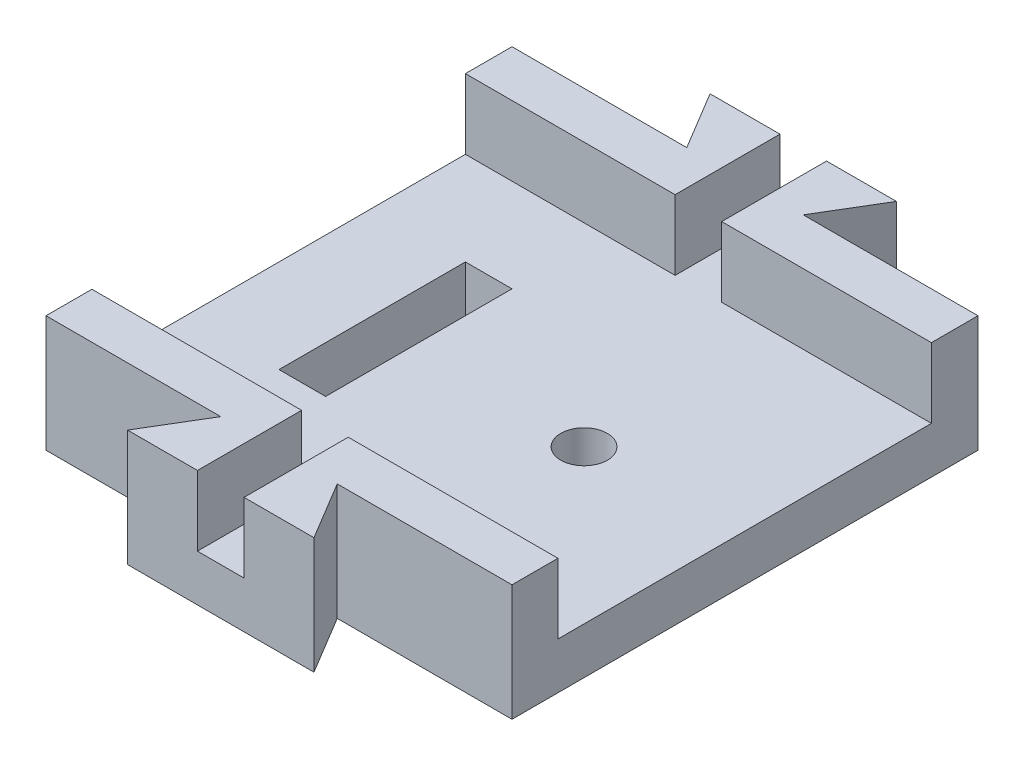
ISO-10303-21;
HEADER;
FILE_DESCRIPTION(('STEP AP214'),'2;1');
FILE_NAME('part.step','',(''),(''),'','','');
FILE_SCHEMA(('AUTOMOTIVE_DESIGN { 1 0 10303 214 1 1 1 1 }'));
ENDSEC;
DATA;
#1=APPLICATION_CONTEXT('core data for automotive mechanical design processes');
#2=APPLICATION_PROTOCOL_DEFINITION('international standard','automotive_design',2000,#1);
#3=PRODUCT_CONTEXT('',#1,'mechanical');
#4=PRODUCT('Part','Part','',(#3));
#5=PRODUCT_RELATED_PRODUCT_CATEGORY('part','',(#4));
#6=PRODUCT_DEFINITION_FORMATION('','',#4);
#7=PRODUCT_DEFINITION_CONTEXT('part definition',#1,'design');
#8=PRODUCT_DEFINITION('design','',#6,#7);
#9=PRODUCT_DEFINITION_SHAPE('','',#8);
#10=(LENGTH_UNIT() NAMED_UNIT(*) SI_UNIT(.MILLI.,.METRE.));
#11=(NAMED_UNIT(*) PLANE_ANGLE_UNIT() SI_UNIT($,.RADIAN.));
#12=(NAMED_UNIT(*) SI_UNIT($,.STERADIAN.) SOLID_ANGLE_UNIT());
#13=UNCERTAINTY_MEASURE_WITH_UNIT(LENGTH_MEASURE(1.E-05),#10,'distance_accuracy_value','');
#14=(GEOMETRIC_REPRESENTATION_CONTEXT(3) GLOBAL_UNCERTAINTY_ASSIGNED_CONTEXT((#13)) GLOBAL_UNIT_ASSIGNED_CONTEXT((#10,
#11,#12)) REPRESENTATION_CONTEXT('',''));
#15=CARTESIAN_POINT('',(0.,0.,0.));
#16=DIRECTION('',(0.,0.,1.));
#17=DIRECTION('',(1.,0.,0.));
#18=AXIS2_PLACEMENT_3D('',#15,#16,#17);
#19=CARTESIAN_POINT('',(0.,50.,0.));
#20=DIRECTION('',(0.,1.,0.));
#21=DIRECTION('',(0.,0.,1.));
#22=AXIS2_PLACEMENT_3D('',#19,#20,#21);
#23=PLANE('',#22);
#24=DIRECTION('',(-1.,0.,0.));
#25=VECTOR('',#24,1.);
#26=CARTESIAN_POINT('',(-59.3210532121283,50.,-154.932071061972));
#27=LINE('',#26,#25);
#28=CARTESIAN_POINT('',(140.678946787872,50.,-154.932071061972));
#29=VERTEX_POINT('',#28);
#30=CARTESIAN_POINT('',(50.6789467878717,50.,-154.932071061972));
#31=VERTEX_POINT('',#30);
#32=EDGE_CURVE('E402',#29,#31,#27,.T.);
#33=ORIENTED_EDGE('',*,*,#32,.F.);
#34=DIRECTION('',(0.,0.,-1.));
#35=VECTOR('',#34,1.);
#36=CARTESIAN_POINT('',(140.678946787872,50.,-174.932071061972));
#37=LINE('',#36,#35);
#38=CARTESIAN_POINT('',(140.678946787872,50.,-174.932071061972));
#39=VERTEX_POINT('',#38);
#40=EDGE_CURVE('E247',#29,#39,#37,.T.);
#41=ORIENTED_EDGE('',*,*,#40,.T.);
#42=DIRECTION('',(-1.,0.,0.));
#43=VECTOR('',#42,1.);
#44=CARTESIAN_POINT('',(-59.3210532121283,50.,-174.932071061972));
#45=LINE('',#44,#43);
#46=CARTESIAN_POINT('',(65.6789467878717,50.,-174.932071061972));
#47=VERTEX_POINT('',#46);
#48=EDGE_CURVE('E249',#39,#47,#45,.T.);
#49=ORIENTED_EDGE('',*,*,#48,.T.);
#50=DIRECTION('',(-0.514495755427526,0.,0.857492925712544));
#51=VECTOR('',#50,1.);
#52=CARTESIAN_POINT('',(80.6789467878717,50.,-199.932071061972));
#53=LINE('',#52,#51);
#54=CARTESIAN_POINT('',(80.6789467878717,50.,-199.932071061972));
#55=VERTEX_POINT('',#54);
#56=EDGE_CURVE('E322',#55,#47,#53,.T.);
#57=ORIENTED_EDGE('',*,*,#56,.F.);
#58=DIRECTION('',(1.,0.,0.));
#59=VECTOR('',#58,1.);
#60=CARTESIAN_POINT('',(0.678946787871695,50.,-199.932071061972));
#61=LINE('',#60,#59);
#62=CARTESIAN_POINT('',(50.6789467878717,50.,-199.932071061972));
#63=VERTEX_POINT('',#62);
#64=EDGE_CURVE('E325',#63,#55,#61,.T.);
#65=ORIENTED_EDGE('',*,*,#64,.F.);
#66=DIRECTION('',(0.,0.,1.));
#67=VECTOR('',#66,1.);
#68=CARTESIAN_POINT('',(50.6789467878717,50.,-154.932071061972));
#69=LINE('',#68,#67);
#70=EDGE_CURVE('E287',#63,#31,#69,.T.);
#71=ORIENTED_EDGE('',*,*,#70,.T.);
#72=EDGE_LOOP('',(#33,#41,#49,#57,#65,#71));
#73=FACE_BOUND('',#72,.T.);
#74=ADVANCED_FACE('F39',(#73),#23,.T.);
#75=DIRECTION('',(0.,0.,1.));
#76=VECTOR('',#75,1.);
#77=CARTESIAN_POINT('',(-59.3210532121283,50.,-174.932071061972));
#78=LINE('',#77,#76);
#79=CARTESIAN_POINT('',(-59.3210532121283,50.,-174.932071061972));
#80=VERTEX_POINT('',#79);
#81=CARTESIAN_POINT('',(-59.3210532121283,50.,-154.932071061972));
#82=VERTEX_POINT('',#81);
#83=EDGE_CURVE('E423',#80,#82,#78,.T.);
#84=ORIENTED_EDGE('',*,*,#83,.T.);
#85=CARTESIAN_POINT('',(30.6789467878717,50.,-154.932071061972));
#86=VERTEX_POINT('',#85);
#87=EDGE_CURVE('E401',#86,#82,#27,.T.);
#88=ORIENTED_EDGE('',*,*,#87,.F.);
#89=DIRECTION('',(0.,0.,-1.));
#90=VECTOR('',#89,1.);
#91=CARTESIAN_POINT('',(30.6789467878717,50.,-199.932071061972));
#92=LINE('',#91,#90);
#93=CARTESIAN_POINT('',(30.6789467878717,50.,-199.932071061972));
#94=VERTEX_POINT('',#93);
#95=EDGE_CURVE('E282',#86,#94,#92,.T.);
#96=ORIENTED_EDGE('',*,*,#95,.T.);
#97=CARTESIAN_POINT('',(0.678946787871695,50.,-199.932071061972));
#98=VERTEX_POINT('',#97);
#99=EDGE_CURVE('E326',#98,#94,#61,.T.);
#100=ORIENTED_EDGE('',*,*,#99,.F.);
#101=DIRECTION('',(-0.514495755427526,0.,-0.857492925712544));
#102=VECTOR('',#101,1.);
#103=CARTESIAN_POINT('',(15.6789467878717,50.,-174.932071061972));
#104=LINE('',#103,#102);
#105=CARTESIAN_POINT('',(15.6789467878717,50.,-174.932071061972));
#106=VERTEX_POINT('',#105);
#107=EDGE_CURVE('E319',#106,#98,#104,.T.);
#108=ORIENTED_EDGE('',*,*,#107,.F.);
#109=EDGE_CURVE('E246',#106,#80,#45,.T.);
#110=ORIENTED_EDGE('',*,*,#109,.T.);
#111=EDGE_LOOP('',(#84,#88,#96,#100,#108,#110));
#112=FACE_BOUND('',#111,.T.);
#113=ADVANCED_FACE('F499',(#112),#23,.T.);
#114=DIRECTION('',(1.,0.,0.));
#115=VECTOR('',#114,1.);
#116=CARTESIAN_POINT('',(-72.3210532121284,50.,5.36086052880691));
#117=LINE('',#116,#115);
#118=CARTESIAN_POINT('',(50.6789467878717,50.,5.36086052880691));
#119=VERTEX_POINT('',#118);
#120=CARTESIAN_POINT('',(140.678946787872,50.,5.36086052880691));
#121=VERTEX_POINT('',#120);
#122=EDGE_CURVE('E221',#119,#121,#117,.T.);
#123=ORIENTED_EDGE('',*,*,#122,.F.);
#124=DIRECTION('',(0.,0.,-1.));
#125=VECTOR('',#124,1.);
#126=CARTESIAN_POINT('',(50.6789467878717,50.,5.06792893802841));
#127=LINE('',#126,#125);
#128=CARTESIAN_POINT('',(50.6789467878717,50.,50.0679289380284));
#129=VERTEX_POINT('',#128);
#130=EDGE_CURVE('E345',#129,#119,#127,.T.);
#131=ORIENTED_EDGE('',*,*,#130,.F.);
#132=DIRECTION('',(1.,0.,0.));
#133=VECTOR('',#132,1.);
#134=CARTESIAN_POINT('',(0.678946787871695,50.,50.0679289380284));
#135=LINE('',#134,#133);
#136=CARTESIAN_POINT('',(80.6789467878717,50.,50.0679289380284));
#137=VERTEX_POINT('',#136);
#138=EDGE_CURVE('E366',#129,#137,#135,.T.);
#139=ORIENTED_EDGE('',*,*,#138,.T.);
#140=DIRECTION('',(-0.514495755427526,0.,-0.857492925712544));
#141=VECTOR('',#140,1.);
#142=CARTESIAN_POINT('',(80.6789467878717,50.,50.0679289380284));
#143=LINE('',#142,#141);
#144=CARTESIAN_POINT('',(65.6789467878717,50.,25.0679289380284));
#145=VERTEX_POINT('',#144);
#146=EDGE_CURVE('E371',#137,#145,#143,.T.);
#147=ORIENTED_EDGE('',*,*,#146,.T.);
#148=DIRECTION('',(1.,0.,0.));
#149=VECTOR('',#148,1.);
#150=CARTESIAN_POINT('',(-59.3210532121283,50.,25.0679289380284));
#151=LINE('',#150,#149);
#152=CARTESIAN_POINT('',(140.678946787872,50.,25.0679289380284));
#153=VERTEX_POINT('',#152);
#154=EDGE_CURVE('E244',#145,#153,#151,.T.);
#155=ORIENTED_EDGE('',*,*,#154,.T.);
#156=EDGE_CURVE('E237',#153,#121,#37,.T.);
#157=ORIENTED_EDGE('',*,*,#156,.T.);
#158=EDGE_LOOP('',(#123,#131,#139,#147,#155,#157));
#159=FACE_BOUND('',#158,.T.);
#160=ADVANCED_FACE('F242',(#159),#23,.T.);
#161=CARTESIAN_POINT('',(-59.3210532121283,50.,5.36086052880691));
#162=VERTEX_POINT('',#161);
#163=CARTESIAN_POINT('',(30.6789467878717,50.,5.36086052880692));
#164=VERTEX_POINT('',#163);
#165=EDGE_CURVE('E54',#162,#164,#117,.T.);
#166=ORIENTED_EDGE('',*,*,#165,.F.);
#167=CARTESIAN_POINT('',(-59.3210532121283,50.,25.0679289380284));
#168=VERTEX_POINT('',#167);
#169=EDGE_CURVE('E271',#162,#168,#78,.T.);
#170=ORIENTED_EDGE('',*,*,#169,.T.);
#171=CARTESIAN_POINT('',(15.6789467878717,50.,25.0679289380284));
#172=VERTEX_POINT('',#171);
#173=EDGE_CURVE('E251',#168,#172,#151,.T.);
#174=ORIENTED_EDGE('',*,*,#173,.T.);
#175=DIRECTION('',(-0.514495755427526,0.,0.857492925712544));
#176=VECTOR('',#175,1.);
#177=CARTESIAN_POINT('',(15.6789467878717,50.,25.0679289380284));
#178=LINE('',#177,#176);
#179=CARTESIAN_POINT('',(0.678946787871695,50.,50.0679289380284));
#180=VERTEX_POINT('',#179);
#181=EDGE_CURVE('E363',#172,#180,#178,.T.);
#182=ORIENTED_EDGE('',*,*,#181,.T.);
#183=CARTESIAN_POINT('',(30.6789467878717,50.,50.0679289380284));
#184=VERTEX_POINT('',#183);
#185=EDGE_CURVE('E368',#180,#184,#135,.T.);
#186=ORIENTED_EDGE('',*,*,#185,.T.);
#187=DIRECTION('',(0.,0.,1.));
#188=VECTOR('',#187,1.);
#189=CARTESIAN_POINT('',(30.6789467878717,50.,50.0679289380284));
#190=LINE('',#189,#188);
#191=EDGE_CURVE('E350',#164,#184,#190,.T.);
#192=ORIENTED_EDGE('',*,*,#191,.F.);
#193=EDGE_LOOP('',(#166,#170,#174,#182,#186,#192));
#194=FACE_BOUND('',#193,.T.);
#195=ADVANCED_FACE('F432',(#194),#23,.T.);
#196=CARTESIAN_POINT('',(-59.3210532121283,50.,-154.932071061972));
#197=DIRECTION('',(0.,0.,1.));
#198=DIRECTION('',(1.,0.,0.));
#199=AXIS2_PLACEMENT_3D('',#196,#197,#198);
#200=PLANE('',#199);
#201=ORIENTED_EDGE('',*,*,#32,.T.);
#202=DIRECTION('',(0.,1.,0.));
#203=VECTOR('',#202,1.);
#204=CARTESIAN_POINT('',(50.6789467878717,20.,-154.932071061972));
#205=LINE('',#204,#203);
#206=CARTESIAN_POINT('',(50.6789467878717,20.,-154.932071061972));
#207=VERTEX_POINT('',#206);
#208=EDGE_CURVE('E313',#207,#31,#205,.T.);
#209=ORIENTED_EDGE('',*,*,#208,.F.);
#210=DIRECTION('',(-1.,0.,0.));
#211=VECTOR('',#210,1.);
#212=CARTESIAN_POINT('',(-59.3210532121283,20.,-154.932071061972));
#213=LINE('',#212,#211);
#214=CARTESIAN_POINT('',(140.678946787872,20.,-154.932071061972));
#215=VERTEX_POINT('',#214);
#216=EDGE_CURVE('E398',#215,#207,#213,.T.);
#217=ORIENTED_EDGE('',*,*,#216,.F.);
#218=DIRECTION('',(0.,1.,0.));
#219=VECTOR('',#218,1.);
#220=CARTESIAN_POINT('',(140.678946787872,50.,-154.932071061972));
#221=LINE('',#220,#219);
#222=EDGE_CURVE('E230',#215,#29,#221,.T.);
#223=ORIENTED_EDGE('',*,*,#222,.T.);
#224=EDGE_LOOP('',(#201,#209,#217,#223));
#225=FACE_BOUND('',#224,.T.);
#226=ADVANCED_FACE('F477',(#225),#200,.T.);
#227=CARTESIAN_POINT('',(30.6789467878717,20.,-154.932071061972));
#228=VERTEX_POINT('',#227);
#229=CARTESIAN_POINT('',(-59.3210532121283,20.,-154.932071061972));
#230=VERTEX_POINT('',#229);
#231=EDGE_CURVE('E397',#228,#230,#213,.T.);
#232=ORIENTED_EDGE('',*,*,#231,.F.);
#233=DIRECTION('',(0.,1.,0.));
#234=VECTOR('',#233,1.);
#235=CARTESIAN_POINT('',(30.6789467878717,20.,-154.932071061972));
#236=LINE('',#235,#234);
#237=EDGE_CURVE('E315',#228,#86,#236,.T.);
#238=ORIENTED_EDGE('',*,*,#237,.T.);
#239=ORIENTED_EDGE('',*,*,#87,.T.);
#240=DIRECTION('',(0.,1.,0.));
#241=VECTOR('',#240,1.);
#242=CARTESIAN_POINT('',(-59.3210532121283,50.,-154.932071061972));
#243=LINE('',#242,#241);
#244=EDGE_CURVE('E461',#230,#82,#243,.T.);
#245=ORIENTED_EDGE('',*,*,#244,.F.);
#246=EDGE_LOOP('',(#232,#238,#239,#245));
#247=FACE_BOUND('',#246,.T.);
#248=ADVANCED_FACE('F505',(#247),#200,.T.);
#249=CARTESIAN_POINT('',(0.678946787871695,50.,-199.932071061972));
#250=DIRECTION('',(0.,0.,-1.));
#251=DIRECTION('',(-1.,0.,0.));
#252=AXIS2_PLACEMENT_3D('',#249,#250,#251);
#253=PLANE('',#252);
#254=DIRECTION('',(1.,0.,0.));
#255=VECTOR('',#254,1.);
#256=CARTESIAN_POINT('',(50.6789467878717,20.,-199.932071061972));
#257=LINE('',#256,#255);
#258=CARTESIAN_POINT('',(30.6789467878717,20.,-199.932071061972));
#259=VERTEX_POINT('',#258);
#260=CARTESIAN_POINT('',(50.6789467878717,20.,-199.932071061972));
#261=VERTEX_POINT('',#260);
#262=EDGE_CURVE('E299',#259,#261,#257,.T.);
#263=ORIENTED_EDGE('',*,*,#262,.T.);
#264=DIRECTION('',(0.,1.,0.));
#265=VECTOR('',#264,1.);
#266=CARTESIAN_POINT('',(50.6789467878717,20.,-199.932071061972));
#267=LINE('',#266,#265);
#268=EDGE_CURVE('E309',#261,#63,#267,.T.);
#269=ORIENTED_EDGE('',*,*,#268,.T.);
#270=ORIENTED_EDGE('',*,*,#64,.T.);
#271=DIRECTION('',(0.,-1.,0.));
#272=VECTOR('',#271,1.);
#273=CARTESIAN_POINT('',(80.6789467878717,50.,-199.932071061972));
#274=LINE('',#273,#272);
#275=CARTESIAN_POINT('',(80.6789467878717,0.,-199.932071061972));
#276=VERTEX_POINT('',#275);
#277=EDGE_CURVE('E338',#55,#276,#274,.T.);
#278=ORIENTED_EDGE('',*,*,#277,.T.);
#279=DIRECTION('',(1.,0.,0.));
#280=VECTOR('',#279,1.);
#281=CARTESIAN_POINT('',(0.678946787871695,0.,-199.932071061972));
#282=LINE('',#281,#280);
#283=CARTESIAN_POINT('',(0.678946787871695,0.,-199.932071061972));
#284=VERTEX_POINT('',#283);
#285=EDGE_CURVE('E323',#284,#276,#282,.T.);
#286=ORIENTED_EDGE('',*,*,#285,.F.);
#287=DIRECTION('',(0.,-1.,0.));
#288=VECTOR('',#287,1.);
#289=CARTESIAN_POINT('',(0.678946787871695,50.,-199.932071061972));
#290=LINE('',#289,#288);
#291=EDGE_CURVE('E329',#98,#284,#290,.T.);
#292=ORIENTED_EDGE('',*,*,#291,.F.);
#293=ORIENTED_EDGE('',*,*,#99,.T.);
#294=DIRECTION('',(0.,1.,0.));
#295=VECTOR('',#294,1.);
#296=CARTESIAN_POINT('',(30.6789467878717,20.,-199.932071061972));
#297=LINE('',#296,#295);
#298=EDGE_CURVE('E305',#259,#94,#297,.T.);
#299=ORIENTED_EDGE('',*,*,#298,.F.);
#300=EDGE_LOOP('',(#263,#269,#270,#278,#286,#292,#293,#299));
#301=FACE_BOUND('',#300,.T.);
#302=ADVANCED_FACE('F486',(#301),#253,.T.);
#303=CARTESIAN_POINT('',(-59.3210532121283,50.,-174.932071061972));
#304=DIRECTION('',(0.,0.,1.));
#305=DIRECTION('',(1.,0.,0.));
#306=AXIS2_PLACEMENT_3D('',#303,#304,#305);
#307=PLANE('',#306);
#308=DIRECTION('',(0.,-1.,0.));
#309=VECTOR('',#308,1.);
#310=CARTESIAN_POINT('',(65.6789467878717,50.,-174.932071061972));
#311=LINE('',#310,#309);
#312=CARTESIAN_POINT('',(65.6789467878717,0.,-174.932071061972));
#313=VERTEX_POINT('',#312);
#314=EDGE_CURVE('E340',#47,#313,#311,.T.);
#315=ORIENTED_EDGE('',*,*,#314,.F.);
#316=ORIENTED_EDGE('',*,*,#48,.F.);
#317=DIRECTION('',(0.,-1.,0.));
#318=VECTOR('',#317,1.);
#319=CARTESIAN_POINT('',(140.678946787872,50.,-174.932071061972));
#320=LINE('',#319,#318);
#321=CARTESIAN_POINT('',(140.678946787872,0.,-174.932071061972));
#322=VERTEX_POINT('',#321);
#323=EDGE_CURVE('E274',#39,#322,#320,.T.);
#324=ORIENTED_EDGE('',*,*,#323,.T.);
#325=DIRECTION('',(-1.,0.,0.));
#326=VECTOR('',#325,1.);
#327=CARTESIAN_POINT('',(-59.3210532121283,0.,-174.932071061972));
#328=LINE('',#327,#326);
#329=EDGE_CURVE('E268',#322,#313,#328,.T.);
#330=ORIENTED_EDGE('',*,*,#329,.T.);
#331=EDGE_LOOP('',(#315,#316,#324,#330));
#332=FACE_BOUND('',#331,.T.);
#333=ADVANCED_FACE('F559',(#332),#307,.F.);
#334=CARTESIAN_POINT('',(-59.3210532121283,50.,25.0679289380284));
#335=DIRECTION('',(0.,0.,-1.));
#336=DIRECTION('',(-1.,0.,0.));
#337=AXIS2_PLACEMENT_3D('',#334,#335,#336);
#338=PLANE('',#337);
#339=DIRECTION('',(0.,-1.,0.));
#340=VECTOR('',#339,1.);
#341=CARTESIAN_POINT('',(15.6789467878717,50.,25.0679289380284));
#342=LINE('',#341,#340);
#343=CARTESIAN_POINT('',(15.6789467878717,0.,25.0679289380284));
#344=VERTEX_POINT('',#343);
#345=EDGE_CURVE('E373',#172,#344,#342,.T.);
#346=ORIENTED_EDGE('',*,*,#345,.F.);
#347=ORIENTED_EDGE('',*,*,#173,.F.);
#348=DIRECTION('',(0.,-1.,0.));
#349=VECTOR('',#348,1.);
#350=CARTESIAN_POINT('',(-59.3210532121283,50.,25.0679289380284));
#351=LINE('',#350,#349);
#352=CARTESIAN_POINT('',(-59.3210532121283,0.,25.0679289380284));
#353=VERTEX_POINT('',#352);
#354=EDGE_CURVE('E47',#168,#353,#351,.T.);
#355=ORIENTED_EDGE('',*,*,#354,.T.);
#356=DIRECTION('',(1.,0.,0.));
#357=VECTOR('',#356,1.);
#358=CARTESIAN_POINT('',(-59.3210532121283,0.,25.0679289380284));
#359=LINE('',#358,#357);
#360=EDGE_CURVE('E262',#353,#344,#359,.T.);
#361=ORIENTED_EDGE('',*,*,#360,.T.);
#362=EDGE_LOOP('',(#346,#347,#355,#361));
#363=FACE_BOUND('',#362,.T.);
#364=ADVANCED_FACE('F438',(#363),#338,.F.);
#365=CARTESIAN_POINT('',(0.,0.,0.));
#366=DIRECTION('',(0.,1.,0.));
#367=DIRECTION('',(0.,0.,1.));
#368=AXIS2_PLACEMENT_3D('',#365,#366,#367);
#369=PLANE('',#368);
#370=CARTESIAN_POINT('',(74.8357304190108,0.,-71.6846808759133));
#371=DIRECTION('',(0.,-1.,0.));
#372=DIRECTION('',(0.,0.,-1.));
#373=AXIS2_PLACEMENT_3D('',#370,#371,#372);
#374=CIRCLE('',#373,9.99999999999999);
#375=CARTESIAN_POINT('',(74.8357304190108,0.,-81.6846808759133));
#376=VERTEX_POINT('',#375);
#377=EDGE_CURVE('E283',#376,#376,#374,.T.);
#378=ORIENTED_EDGE('',*,*,#377,.F.);
#379=EDGE_LOOP('',(#378));
#380=FACE_BOUND('',#379,.T.);
#381=DIRECTION('',(0.,0.,1.));
#382=VECTOR('',#381,1.);
#383=CARTESIAN_POINT('',(-59.3210532121283,0.,-174.932071061972));
#384=LINE('',#383,#382);
#385=CARTESIAN_POINT('',(-59.3210532121283,0.,-174.932071061972));
#386=VERTEX_POINT('',#385);
#387=EDGE_CURVE('E257',#386,#353,#384,.T.);
#388=ORIENTED_EDGE('',*,*,#387,.F.);
#389=CARTESIAN_POINT('',(15.6789467878717,0.,-174.932071061972));
#390=VERTEX_POINT('',#389);
#391=EDGE_CURVE('E267',#390,#386,#328,.T.);
#392=ORIENTED_EDGE('',*,*,#391,.F.);
#393=DIRECTION('',(-0.514495755427526,0.,-0.857492925712544));
#394=VECTOR('',#393,1.);
#395=CARTESIAN_POINT('',(15.6789467878717,0.,-174.932071061972));
#396=LINE('',#395,#394);
#397=EDGE_CURVE('E312',#390,#284,#396,.T.);
#398=ORIENTED_EDGE('',*,*,#397,.T.);
#399=ORIENTED_EDGE('',*,*,#285,.T.);
#400=DIRECTION('',(-0.514495755427526,0.,0.857492925712544));
#401=VECTOR('',#400,1.);
#402=CARTESIAN_POINT('',(80.6789467878717,0.,-199.932071061972));
#403=LINE('',#402,#401);
#404=EDGE_CURVE('E332',#276,#313,#403,.T.);
#405=ORIENTED_EDGE('',*,*,#404,.T.);
#406=ORIENTED_EDGE('',*,*,#329,.F.);
#407=DIRECTION('',(0.,0.,-1.));
#408=VECTOR('',#407,1.);
#409=CARTESIAN_POINT('',(140.678946787872,0.,-174.932071061972));
#410=LINE('',#409,#408);
#411=CARTESIAN_POINT('',(140.678946787872,0.,25.0679289380284));
#412=VERTEX_POINT('',#411);
#413=EDGE_CURVE('E265',#412,#322,#410,.T.);
#414=ORIENTED_EDGE('',*,*,#413,.F.);
#415=CARTESIAN_POINT('',(65.6789467878717,0.,25.0679289380284));
#416=VERTEX_POINT('',#415);
#417=EDGE_CURVE('E260',#416,#412,#359,.T.);
#418=ORIENTED_EDGE('',*,*,#417,.F.);
#419=DIRECTION('',(-0.514495755427526,0.,-0.857492925712544));
#420=VECTOR('',#419,1.);
#421=CARTESIAN_POINT('',(80.6789467878717,0.,50.0679289380284));
#422=LINE('',#421,#420);
#423=CARTESIAN_POINT('',(80.6789467878717,0.,50.0679289380284));
#424=VERTEX_POINT('',#423);
#425=EDGE_CURVE('E367',#424,#416,#422,.T.);
#426=ORIENTED_EDGE('',*,*,#425,.F.);
#427=DIRECTION('',(1.,0.,0.));
#428=VECTOR('',#427,1.);
#429=CARTESIAN_POINT('',(0.678946787871695,0.,50.0679289380284));
#430=LINE('',#429,#428);
#431=CARTESIAN_POINT('',(0.678946787871695,0.,50.0679289380284));
#432=VERTEX_POINT('',#431);
#433=EDGE_CURVE('E376',#432,#424,#430,.T.);
#434=ORIENTED_EDGE('',*,*,#433,.F.);
#435=DIRECTION('',(-0.514495755427526,0.,0.857492925712544));
#436=VECTOR('',#435,1.);
#437=CARTESIAN_POINT('',(15.6789467878717,0.,25.0679289380284));
#438=LINE('',#437,#436);
#439=EDGE_CURVE('E361',#344,#432,#438,.T.);
#440=ORIENTED_EDGE('',*,*,#439,.F.);
#441=ORIENTED_EDGE('',*,*,#360,.F.);
#442=EDGE_LOOP('',(#388,#392,#398,#399,#405,#406,#414,#418,#426,#434,#440,#441));
#443=FACE_BOUND('',#442,.T.);
#444=DIRECTION('',(0.,0.,1.));
#445=VECTOR('',#444,1.);
#446=CARTESIAN_POINT('',(-19.3210532121283,0.,-34.9320710619716));
#447=LINE('',#446,#445);
#448=CARTESIAN_POINT('',(-19.3210532121283,0.,-114.932071061972));
#449=VERTEX_POINT('',#448);
#450=CARTESIAN_POINT('',(-19.3210532121283,0.,-34.9320710619716));
#451=VERTEX_POINT('',#450);
#452=EDGE_CURVE('E405',#449,#451,#447,.T.);
#453=ORIENTED_EDGE('',*,*,#452,.T.);
#454=DIRECTION('',(1.,0.,0.));
#455=VECTOR('',#454,1.);
#456=CARTESIAN_POINT('',(-19.3210532121283,0.,-34.9320710619716));
#457=LINE('',#456,#455);
#458=CARTESIAN_POINT('',(0.678946787871698,0.,-34.9320710619716));
#459=VERTEX_POINT('',#458);
#460=EDGE_CURVE('E408',#451,#459,#457,.T.);
#461=ORIENTED_EDGE('',*,*,#460,.T.);
#462=DIRECTION('',(0.,0.,-1.));
#463=VECTOR('',#462,1.);
#464=CARTESIAN_POINT('',(0.678946787871698,0.,-34.9320710619716));
#465=LINE('',#464,#463);
#466=CARTESIAN_POINT('',(0.678946787871698,0.,-114.932071061972));
#467=VERTEX_POINT('',#466);
#468=EDGE_CURVE('E411',#459,#467,#465,.T.);
#469=ORIENTED_EDGE('',*,*,#468,.T.);
#470=DIRECTION('',(-1.,0.,0.));
#471=VECTOR('',#470,1.);
#472=CARTESIAN_POINT('',(-19.3210532121283,0.,-114.932071061972));
#473=LINE('',#472,#471);
#474=EDGE_CURVE('E414',#467,#449,#473,.T.);
#475=ORIENTED_EDGE('',*,*,#474,.T.);
#476=EDGE_LOOP('',(#453,#461,#469,#475));
#477=FACE_BOUND('',#476,.T.);
#478=ADVANCED_FACE('F444',(#380,#443,#477),#369,.F.);
#479=CARTESIAN_POINT('',(-59.3210532121283,50.,-174.932071061972));
#480=DIRECTION('',(1.,0.,0.));
#481=DIRECTION('',(0.,0.,-1.));
#482=AXIS2_PLACEMENT_3D('',#479,#480,#481);
#483=PLANE('',#482);
#484=DIRECTION('',(0.,0.,-1.));
#485=VECTOR('',#484,1.);
#486=CARTESIAN_POINT('',(-59.3210532121283,20.,-174.932071061972));
#487=LINE('',#486,#485);
#488=CARTESIAN_POINT('',(-59.3210532121283,20.,5.36086052880691));
#489=VERTEX_POINT('',#488);
#490=EDGE_CURVE('E463',#489,#230,#487,.T.);
#491=ORIENTED_EDGE('',*,*,#490,.T.);
#492=ORIENTED_EDGE('',*,*,#244,.T.);
#493=ORIENTED_EDGE('',*,*,#83,.F.);
#494=DIRECTION('',(0.,-1.,0.));
#495=VECTOR('',#494,1.);
#496=CARTESIAN_POINT('',(-59.3210532121283,50.,-174.932071061972));
#497=LINE('',#496,#495);
#498=EDGE_CURVE('E256',#80,#386,#497,.T.);
#499=ORIENTED_EDGE('',*,*,#498,.T.);
#500=ORIENTED_EDGE('',*,*,#387,.T.);
#501=ORIENTED_EDGE('',*,*,#354,.F.);
#502=ORIENTED_EDGE('',*,*,#169,.F.);
#503=DIRECTION('',(0.,-1.,0.));
#504=VECTOR('',#503,1.);
#505=CARTESIAN_POINT('',(-59.3210532121283,50.,5.36086052880691));
#506=LINE('',#505,#504);
#507=EDGE_CURVE('E290',#162,#489,#506,.T.);
#508=ORIENTED_EDGE('',*,*,#507,.T.);
#509=EDGE_LOOP('',(#491,#492,#493,#499,#500,#501,#502,#508));
#510=FACE_BOUND('',#509,.T.);
#511=ADVANCED_FACE('F41',(#510),#483,.F.);
#512=ORIENTED_EDGE('',*,*,#154,.F.);
#513=DIRECTION('',(0.,-1.,0.));
#514=VECTOR('',#513,1.);
#515=CARTESIAN_POINT('',(65.6789467878717,50.,25.0679289380284));
#516=LINE('',#515,#514);
#517=EDGE_CURVE('E380',#145,#416,#516,.T.);
#518=ORIENTED_EDGE('',*,*,#517,.T.);
#519=ORIENTED_EDGE('',*,*,#417,.T.);
#520=DIRECTION('',(0.,-1.,0.));
#521=VECTOR('',#520,1.);
#522=CARTESIAN_POINT('',(140.678946787872,50.,25.0679289380284));
#523=LINE('',#522,#521);
#524=EDGE_CURVE('E277',#153,#412,#523,.T.);
#525=ORIENTED_EDGE('',*,*,#524,.F.);
#526=EDGE_LOOP('',(#512,#518,#519,#525));
#527=FACE_BOUND('',#526,.T.);
#528=ADVANCED_FACE('F634',(#527),#338,.F.);
#529=CARTESIAN_POINT('',(140.678946787872,50.,-174.932071061972));
#530=DIRECTION('',(-1.,0.,0.));
#531=DIRECTION('',(0.,0.,1.));
#532=AXIS2_PLACEMENT_3D('',#529,#530,#531);
#533=PLANE('',#532);
#534=ORIENTED_EDGE('',*,*,#40,.F.);
#535=ORIENTED_EDGE('',*,*,#222,.F.);
#536=DIRECTION('',(0.,0.,-1.));
#537=VECTOR('',#536,1.);
#538=CARTESIAN_POINT('',(140.678946787872,20.,-154.932071061972));
#539=LINE('',#538,#537);
#540=CARTESIAN_POINT('',(140.678946787872,20.,5.36086052880691));
#541=VERTEX_POINT('',#540);
#542=EDGE_CURVE('E240',#541,#215,#539,.T.);
#543=ORIENTED_EDGE('',*,*,#542,.F.);
#544=DIRECTION('',(0.,-1.,0.));
#545=VECTOR('',#544,1.);
#546=CARTESIAN_POINT('',(140.678946787872,20.,5.36086052880691));
#547=LINE('',#546,#545);
#548=EDGE_CURVE('E224',#121,#541,#547,.T.);
#549=ORIENTED_EDGE('',*,*,#548,.F.);
#550=ORIENTED_EDGE('',*,*,#156,.F.);
#551=ORIENTED_EDGE('',*,*,#524,.T.);
#552=ORIENTED_EDGE('',*,*,#413,.T.);
#553=ORIENTED_EDGE('',*,*,#323,.F.);
#554=EDGE_LOOP('',(#534,#535,#543,#549,#550,#551,#552,#553));
#555=FACE_BOUND('',#554,.T.);
#556=ADVANCED_FACE('F235',(#555),#533,.F.);
#557=ORIENTED_EDGE('',*,*,#109,.F.);
#558=DIRECTION('',(0.,-1.,0.));
#559=VECTOR('',#558,1.);
#560=CARTESIAN_POINT('',(15.6789467878717,50.,-174.932071061972));
#561=LINE('',#560,#559);
#562=EDGE_CURVE('E342',#106,#390,#561,.T.);
#563=ORIENTED_EDGE('',*,*,#562,.T.);
#564=ORIENTED_EDGE('',*,*,#391,.T.);
#565=ORIENTED_EDGE('',*,*,#498,.F.);
#566=EDGE_LOOP('',(#557,#563,#564,#565));
#567=FACE_BOUND('',#566,.T.);
#568=ADVANCED_FACE('F552',(#567),#307,.F.);
#569=CARTESIAN_POINT('',(-19.3210532121283,50.,-34.9320710619716));
#570=DIRECTION('',(1.,0.,0.));
#571=DIRECTION('',(0.,0.,-1.));
#572=AXIS2_PLACEMENT_3D('',#569,#570,#571);
#573=PLANE('',#572);
#574=DIRECTION('',(0.,0.,-1.));
#575=VECTOR('',#574,1.);
#576=CARTESIAN_POINT('',(-19.3210532121283,20.,-34.9320710619716));
#577=LINE('',#576,#575);
#578=CARTESIAN_POINT('',(-19.3210532121283,20.,-34.9320710619716));
#579=VERTEX_POINT('',#578);
#580=CARTESIAN_POINT('',(-19.3210532121283,20.,-114.932071061972));
#581=VERTEX_POINT('',#580);
#582=EDGE_CURVE('E395',#579,#581,#577,.T.);
#583=ORIENTED_EDGE('',*,*,#582,.F.);
#584=DIRECTION('',(0.,-1.,0.));
#585=VECTOR('',#584,1.);
#586=CARTESIAN_POINT('',(-19.3210532121283,50.,-34.9320710619716));
#587=LINE('',#586,#585);
#588=EDGE_CURVE('E261',#579,#451,#587,.T.);
#589=ORIENTED_EDGE('',*,*,#588,.T.);
#590=ORIENTED_EDGE('',*,*,#452,.F.);
#591=DIRECTION('',(0.,-1.,0.));
#592=VECTOR('',#591,1.);
#593=CARTESIAN_POINT('',(-19.3210532121283,50.,-114.932071061972));
#594=LINE('',#593,#592);
#595=EDGE_CURVE('E417',#581,#449,#594,.T.);
#596=ORIENTED_EDGE('',*,*,#595,.F.);
#597=EDGE_LOOP('',(#583,#589,#590,#596));
#598=FACE_BOUND('',#597,.T.);
#599=ADVANCED_FACE('F549',(#598),#573,.T.);
#600=CARTESIAN_POINT('',(-19.3210532121283,50.,-34.9320710619716));
#601=DIRECTION('',(0.,0.,-1.));
#602=DIRECTION('',(-1.,0.,0.));
#603=AXIS2_PLACEMENT_3D('',#600,#601,#602);
#604=PLANE('',#603);
#605=DIRECTION('',(-1.,0.,0.));
#606=VECTOR('',#605,1.);
#607=CARTESIAN_POINT('',(-19.3210532121283,20.,-34.9320710619716));
#608=LINE('',#607,#606);
#609=CARTESIAN_POINT('',(0.678946787871698,20.,-34.9320710619716));
#610=VERTEX_POINT('',#609);
#611=EDGE_CURVE('E393',#610,#579,#608,.T.);
#612=ORIENTED_EDGE('',*,*,#611,.F.);
#613=DIRECTION('',(0.,-1.,0.));
#614=VECTOR('',#613,1.);
#615=CARTESIAN_POINT('',(0.678946787871698,50.,-34.9320710619716));
#616=LINE('',#615,#614);
#617=EDGE_CURVE('E421',#610,#459,#616,.T.);
#618=ORIENTED_EDGE('',*,*,#617,.T.);
#619=ORIENTED_EDGE('',*,*,#460,.F.);
#620=ORIENTED_EDGE('',*,*,#588,.F.);
#621=EDGE_LOOP('',(#612,#618,#619,#620));
#622=FACE_BOUND('',#621,.T.);
#623=ADVANCED_FACE('F546',(#622),#604,.T.);
#624=CARTESIAN_POINT('',(0.678946787871698,50.,-34.9320710619716));
#625=DIRECTION('',(-1.,0.,0.));
#626=DIRECTION('',(0.,0.,1.));
#627=AXIS2_PLACEMENT_3D('',#624,#625,#626);
#628=PLANE('',#627);
#629=DIRECTION('',(0.,0.,1.));
#630=VECTOR('',#629,1.);
#631=CARTESIAN_POINT('',(0.678946787871698,20.,-34.9320710619716));
#632=LINE('',#631,#630);
#633=CARTESIAN_POINT('',(0.678946787871698,20.,-114.932071061972));
#634=VERTEX_POINT('',#633);
#635=EDGE_CURVE('E391',#634,#610,#632,.T.);
#636=ORIENTED_EDGE('',*,*,#635,.F.);
#637=DIRECTION('',(0.,-1.,0.));
#638=VECTOR('',#637,1.);
#639=CARTESIAN_POINT('',(0.678946787871698,50.,-114.932071061972));
#640=LINE('',#639,#638);
#641=EDGE_CURVE('E419',#634,#467,#640,.T.);
#642=ORIENTED_EDGE('',*,*,#641,.T.);
#643=ORIENTED_EDGE('',*,*,#468,.F.);
#644=ORIENTED_EDGE('',*,*,#617,.F.);
#645=EDGE_LOOP('',(#636,#642,#643,#644));
#646=FACE_BOUND('',#645,.T.);
#647=ADVANCED_FACE('F542',(#646),#628,.T.);
#648=CARTESIAN_POINT('',(-19.3210532121283,50.,-114.932071061972));
#649=DIRECTION('',(0.,0.,1.));
#650=DIRECTION('',(1.,0.,0.));
#651=AXIS2_PLACEMENT_3D('',#648,#649,#650);
#652=PLANE('',#651);
#653=DIRECTION('',(1.,0.,0.));
#654=VECTOR('',#653,1.);
#655=CARTESIAN_POINT('',(-19.3210532121283,20.,-114.932071061972));
#656=LINE('',#655,#654);
#657=EDGE_CURVE('E389',#581,#634,#656,.T.);
#658=ORIENTED_EDGE('',*,*,#657,.F.);
#659=ORIENTED_EDGE('',*,*,#595,.T.);
#660=ORIENTED_EDGE('',*,*,#474,.F.);
#661=ORIENTED_EDGE('',*,*,#641,.F.);
#662=EDGE_LOOP('',(#658,#659,#660,#661));
#663=FACE_BOUND('',#662,.T.);
#664=ADVANCED_FACE('F539',(#663),#652,.T.);
#665=CARTESIAN_POINT('',(0.,20.,0.));
#666=DIRECTION('',(0.,1.,0.));
#667=DIRECTION('',(0.,0.,1.));
#668=AXIS2_PLACEMENT_3D('',#665,#666,#667);
#669=PLANE('',#668);
#670=DIRECTION('',(0.,0.,-1.));
#671=VECTOR('',#670,1.);
#672=CARTESIAN_POINT('',(50.6789467878717,20.,5.06792893802841));
#673=LINE('',#672,#671);
#674=CARTESIAN_POINT('',(50.6789467878717,20.,50.0679289380284));
#675=VERTEX_POINT('',#674);
#676=CARTESIAN_POINT('',(50.6789467878717,20.,5.36086052880691));
#677=VERTEX_POINT('',#676);
#678=EDGE_CURVE('E349',#675,#677,#673,.T.);
#679=ORIENTED_EDGE('',*,*,#678,.T.);
#680=DIRECTION('',(1.,0.,0.));
#681=VECTOR('',#680,1.);
#682=CARTESIAN_POINT('',(-72.3210532121284,20.,5.36086052880691));
#683=LINE('',#682,#681);
#684=EDGE_CURVE('E62',#677,#541,#683,.T.);
#685=ORIENTED_EDGE('',*,*,#684,.T.);
#686=ORIENTED_EDGE('',*,*,#542,.T.);
#687=ORIENTED_EDGE('',*,*,#216,.T.);
#688=DIRECTION('',(0.,0.,1.));
#689=VECTOR('',#688,1.);
#690=CARTESIAN_POINT('',(50.6789467878717,20.,-154.932071061972));
#691=LINE('',#690,#689);
#692=EDGE_CURVE('E304',#261,#207,#691,.T.);
#693=ORIENTED_EDGE('',*,*,#692,.F.);
#694=ORIENTED_EDGE('',*,*,#262,.F.);
#695=DIRECTION('',(0.,0.,-1.));
#696=VECTOR('',#695,1.);
#697=CARTESIAN_POINT('',(30.6789467878717,20.,-199.932071061972));
#698=LINE('',#697,#696);
#699=EDGE_CURVE('E302',#228,#259,#698,.T.);
#700=ORIENTED_EDGE('',*,*,#699,.F.);
#701=ORIENTED_EDGE('',*,*,#231,.T.);
#702=ORIENTED_EDGE('',*,*,#490,.F.);
#703=CARTESIAN_POINT('',(30.6789467878717,20.,5.36086052880691));
#704=VERTEX_POINT('',#703);
#705=EDGE_CURVE('E466',#489,#704,#683,.T.);
#706=ORIENTED_EDGE('',*,*,#705,.T.);
#707=DIRECTION('',(0.,0.,1.));
#708=VECTOR('',#707,1.);
#709=CARTESIAN_POINT('',(30.6789467878717,20.,50.0679289380284));
#710=LINE('',#709,#708);
#711=CARTESIAN_POINT('',(30.6789467878717,20.,50.0679289380284));
#712=VERTEX_POINT('',#711);
#713=EDGE_CURVE('E353',#704,#712,#710,.T.);
#714=ORIENTED_EDGE('',*,*,#713,.T.);
#715=DIRECTION('',(1.,0.,0.));
#716=VECTOR('',#715,1.);
#717=CARTESIAN_POINT('',(50.6789467878717,20.,50.0679289380284));
#718=LINE('',#717,#716);
#719=EDGE_CURVE('E346',#712,#675,#718,.T.);
#720=ORIENTED_EDGE('',*,*,#719,.T.);
#721=EDGE_LOOP('',(#679,#685,#686,#687,#693,#694,#700,#701,#702,#706,#714,#720));
#722=FACE_BOUND('',#721,.T.);
#723=CARTESIAN_POINT('',(74.8357304190108,20.,-71.6846808759133));
#724=DIRECTION('',(0.,1.,0.));
#725=DIRECTION('',(0.,0.,1.));
#726=AXIS2_PLACEMENT_3D('',#723,#724,#725);
#727=CIRCLE('',#726,9.99999999999999);
#728=CARTESIAN_POINT('',(74.8357304190108,20.,-61.6846808759133));
#729=VERTEX_POINT('',#728);
#730=EDGE_CURVE('E280',#729,#729,#727,.T.);
#731=ORIENTED_EDGE('',*,*,#730,.F.);
#732=EDGE_LOOP('',(#731));
#733=FACE_BOUND('',#732,.T.);
#734=ORIENTED_EDGE('',*,*,#582,.T.);
#735=ORIENTED_EDGE('',*,*,#657,.T.);
#736=ORIENTED_EDGE('',*,*,#635,.T.);
#737=ORIENTED_EDGE('',*,*,#611,.T.);
#738=EDGE_LOOP('',(#734,#735,#736,#737));
#739=FACE_BOUND('',#738,.T.);
#740=ADVANCED_FACE('F472',(#722,#733,#739),#669,.T.);
#741=CARTESIAN_POINT('',(15.6789467878717,50.,25.0679289380284));
#742=DIRECTION('',(0.857492925712544,0.,0.514495755427527));
#743=DIRECTION('',(0.514495755427527,0.,-0.857492925712544));
#744=AXIS2_PLACEMENT_3D('',#741,#742,#743);
#745=PLANE('',#744);
#746=ORIENTED_EDGE('',*,*,#439,.T.);
#747=DIRECTION('',(0.,-1.,0.));
#748=VECTOR('',#747,1.);
#749=CARTESIAN_POINT('',(0.678946787871695,50.,50.0679289380284));
#750=LINE('',#749,#748);
#751=EDGE_CURVE('E386',#180,#432,#750,.T.);
#752=ORIENTED_EDGE('',*,*,#751,.F.);
#753=ORIENTED_EDGE('',*,*,#181,.F.);
#754=ORIENTED_EDGE('',*,*,#345,.T.);
#755=EDGE_LOOP('',(#746,#752,#753,#754));
#756=FACE_BOUND('',#755,.T.);
#757=ADVANCED_FACE('F450',(#756),#745,.F.);
#758=CARTESIAN_POINT('',(0.678946787871695,50.,50.0679289380284));
#759=DIRECTION('',(0.,0.,-1.));
#760=DIRECTION('',(-1.,0.,0.));
#761=AXIS2_PLACEMENT_3D('',#758,#759,#760);
#762=PLANE('',#761);
#763=ORIENTED_EDGE('',*,*,#719,.F.);
#764=DIRECTION('',(0.,1.,0.));
#765=VECTOR('',#764,1.);
#766=CARTESIAN_POINT('',(30.6789467878717,20.,50.0679289380284));
#767=LINE('',#766,#765);
#768=EDGE_CURVE('E358',#712,#184,#767,.T.);
#769=ORIENTED_EDGE('',*,*,#768,.T.);
#770=ORIENTED_EDGE('',*,*,#185,.F.);
#771=ORIENTED_EDGE('',*,*,#751,.T.);
#772=ORIENTED_EDGE('',*,*,#433,.T.);
#773=DIRECTION('',(0.,-1.,0.));
#774=VECTOR('',#773,1.);
#775=CARTESIAN_POINT('',(80.6789467878717,50.,50.0679289380284));
#776=LINE('',#775,#774);
#777=EDGE_CURVE('E383',#137,#424,#776,.T.);
#778=ORIENTED_EDGE('',*,*,#777,.F.);
#779=ORIENTED_EDGE('',*,*,#138,.F.);
#780=DIRECTION('',(0.,1.,0.));
#781=VECTOR('',#780,1.);
#782=CARTESIAN_POINT('',(50.6789467878717,20.,50.0679289380284));
#783=LINE('',#782,#781);
#784=EDGE_CURVE('E355',#675,#129,#783,.T.);
#785=ORIENTED_EDGE('',*,*,#784,.F.);
#786=EDGE_LOOP('',(#763,#769,#770,#771,#772,#778,#779,#785));
#787=FACE_BOUND('',#786,.T.);
#788=ADVANCED_FACE('F453',(#787),#762,.F.);
#789=CARTESIAN_POINT('',(80.6789467878717,50.,50.0679289380284));
#790=DIRECTION('',(-0.857492925712544,0.,0.514495755427526));
#791=DIRECTION('',(0.514495755427526,0.,0.857492925712544));
#792=AXIS2_PLACEMENT_3D('',#789,#790,#791);
#793=PLANE('',#792);
#794=ORIENTED_EDGE('',*,*,#425,.T.);
#795=ORIENTED_EDGE('',*,*,#517,.F.);
#796=ORIENTED_EDGE('',*,*,#146,.F.);
#797=ORIENTED_EDGE('',*,*,#777,.T.);
#798=EDGE_LOOP('',(#794,#795,#796,#797));
#799=FACE_BOUND('',#798,.T.);
#800=ADVANCED_FACE('F581',(#799),#793,.F.);
#801=CARTESIAN_POINT('',(30.6789467878717,20.,50.0679289380284));
#802=DIRECTION('',(-1.,0.,0.));
#803=DIRECTION('',(0.,0.,1.));
#804=AXIS2_PLACEMENT_3D('',#801,#802,#803);
#805=PLANE('',#804);
#806=ORIENTED_EDGE('',*,*,#713,.F.);
#807=DIRECTION('',(0.,1.,0.));
#808=VECTOR('',#807,1.);
#809=CARTESIAN_POINT('',(30.6789467878717,20.,5.36086052880691));
#810=LINE('',#809,#808);
#811=EDGE_CURVE('E295',#704,#164,#810,.T.);
#812=ORIENTED_EDGE('',*,*,#811,.T.);
#813=ORIENTED_EDGE('',*,*,#191,.T.);
#814=ORIENTED_EDGE('',*,*,#768,.F.);
#815=EDGE_LOOP('',(#806,#812,#813,#814));
#816=FACE_BOUND('',#815,.T.);
#817=ADVANCED_FACE('F458',(#816),#805,.F.);
#818=CARTESIAN_POINT('',(50.6789467878717,20.,5.06792893802841));
#819=DIRECTION('',(1.,0.,0.));
#820=DIRECTION('',(0.,0.,-1.));
#821=AXIS2_PLACEMENT_3D('',#818,#819,#820);
#822=PLANE('',#821);
#823=ORIENTED_EDGE('',*,*,#130,.T.);
#824=DIRECTION('',(0.,-1.,0.));
#825=VECTOR('',#824,1.);
#826=CARTESIAN_POINT('',(50.6789467878717,20.,5.36086052880691));
#827=LINE('',#826,#825);
#828=EDGE_CURVE('E11',#119,#677,#827,.T.);
#829=ORIENTED_EDGE('',*,*,#828,.T.);
#830=ORIENTED_EDGE('',*,*,#678,.F.);
#831=ORIENTED_EDGE('',*,*,#784,.T.);
#832=EDGE_LOOP('',(#823,#829,#830,#831));
#833=FACE_BOUND('',#832,.T.);
#834=ADVANCED_FACE('F587',(#833),#822,.F.);
#835=CARTESIAN_POINT('',(15.6789467878717,50.,-174.932071061972));
#836=DIRECTION('',(-0.857492925712544,0.,0.514495755427527));
#837=DIRECTION('',(0.514495755427527,0.,0.857492925712544));
#838=AXIS2_PLACEMENT_3D('',#835,#836,#837);
#839=PLANE('',#838);
#840=ORIENTED_EDGE('',*,*,#397,.F.);
#841=ORIENTED_EDGE('',*,*,#562,.F.);
#842=ORIENTED_EDGE('',*,*,#107,.T.);
#843=ORIENTED_EDGE('',*,*,#291,.T.);
#844=EDGE_LOOP('',(#840,#841,#842,#843));
#845=FACE_BOUND('',#844,.T.);
#846=ADVANCED_FACE('F497',(#845),#839,.T.);
#847=CARTESIAN_POINT('',(80.6789467878717,50.,-199.932071061972));
#848=DIRECTION('',(0.857492925712544,0.,0.514495755427526));
#849=DIRECTION('',(0.514495755427526,0.,-0.857492925712544));
#850=AXIS2_PLACEMENT_3D('',#847,#848,#849);
#851=PLANE('',#850);
#852=ORIENTED_EDGE('',*,*,#404,.F.);
#853=ORIENTED_EDGE('',*,*,#277,.F.);
#854=ORIENTED_EDGE('',*,*,#56,.T.);
#855=ORIENTED_EDGE('',*,*,#314,.T.);
#856=EDGE_LOOP('',(#852,#853,#854,#855));
#857=FACE_BOUND('',#856,.T.);
#858=ADVANCED_FACE('F490',(#857),#851,.T.);
#859=CARTESIAN_POINT('',(50.6789467878717,20.,-154.932071061972));
#860=DIRECTION('',(-1.,0.,0.));
#861=DIRECTION('',(0.,0.,1.));
#862=AXIS2_PLACEMENT_3D('',#859,#860,#861);
#863=PLANE('',#862);
#864=ORIENTED_EDGE('',*,*,#70,.F.);
#865=ORIENTED_EDGE('',*,*,#268,.F.);
#866=ORIENTED_EDGE('',*,*,#692,.T.);
#867=ORIENTED_EDGE('',*,*,#208,.T.);
#868=EDGE_LOOP('',(#864,#865,#866,#867));
#869=FACE_BOUND('',#868,.T.);
#870=ADVANCED_FACE('F480',(#869),#863,.T.);
#871=CARTESIAN_POINT('',(30.6789467878717,20.,-199.932071061972));
#872=DIRECTION('',(1.,0.,0.));
#873=DIRECTION('',(0.,0.,-1.));
#874=AXIS2_PLACEMENT_3D('',#871,#872,#873);
#875=PLANE('',#874);
#876=ORIENTED_EDGE('',*,*,#95,.F.);
#877=ORIENTED_EDGE('',*,*,#237,.F.);
#878=ORIENTED_EDGE('',*,*,#699,.T.);
#879=ORIENTED_EDGE('',*,*,#298,.T.);
#880=EDGE_LOOP('',(#876,#877,#878,#879));
#881=FACE_BOUND('',#880,.T.);
#882=ADVANCED_FACE('F501',(#881),#875,.T.);
#883=CARTESIAN_POINT('',(74.8357304190108,28.,-71.6846808759133));
#884=DIRECTION('',(0.,-1.,0.));
#885=DIRECTION('',(0.,0.,-1.));
#886=AXIS2_PLACEMENT_3D('',#883,#884,#885);
#887=CYLINDRICAL_SURFACE('',#886,9.99999999999999);
#888=ORIENTED_EDGE('',*,*,#730,.T.);
#889=EDGE_LOOP('',(#888));
#890=FACE_BOUND('',#889,.T.);
#891=ORIENTED_EDGE('',*,*,#377,.T.);
#892=EDGE_LOOP('',(#891));
#893=FACE_BOUND('',#892,.T.);
#894=ADVANCED_FACE('F514',(#890,#893),#887,.F.);
#895=CARTESIAN_POINT('',(-72.3210532121284,20.,5.36086052880691));
#896=DIRECTION('',(0.,0.,1.));
#897=DIRECTION('',(1.,0.,0.));
#898=AXIS2_PLACEMENT_3D('',#895,#896,#897);
#899=PLANE('',#898);
#900=ORIENTED_EDGE('',*,*,#122,.T.);
#901=ORIENTED_EDGE('',*,*,#548,.T.);
#902=ORIENTED_EDGE('',*,*,#684,.F.);
#903=ORIENTED_EDGE('',*,*,#828,.F.);
#904=EDGE_LOOP('',(#900,#901,#902,#903));
#905=FACE_BOUND('',#904,.T.);
#906=ADVANCED_FACE('F223',(#905),#899,.F.);
#907=ORIENTED_EDGE('',*,*,#165,.T.);
#908=ORIENTED_EDGE('',*,*,#811,.F.);
#909=ORIENTED_EDGE('',*,*,#705,.F.);
#910=ORIENTED_EDGE('',*,*,#507,.F.);
#911=EDGE_LOOP('',(#907,#908,#909,#910));
#912=FACE_BOUND('',#911,.T.);
#913=ADVANCED_FACE('F508',(#912),#899,.F.);
#914=CLOSED_SHELL('',(#74,#113,#160,#195,#226,#248,#302,#333,#364,#478,#511,#528,#556,#568,#599,
#623,#647,#664,#740,#757,#788,#800,#817,#834,#846,#858,#870,#882,#894,#906,#913));
#915=MANIFOLD_SOLID_BREP('B2',#914);
#916=ADVANCED_BREP_SHAPE_REPRESENTATION('',(#18,#915),#14);
#917=SHAPE_DEFINITION_REPRESENTATION(#9,#916);
ENDSEC;
END-ISO-10303-21;
